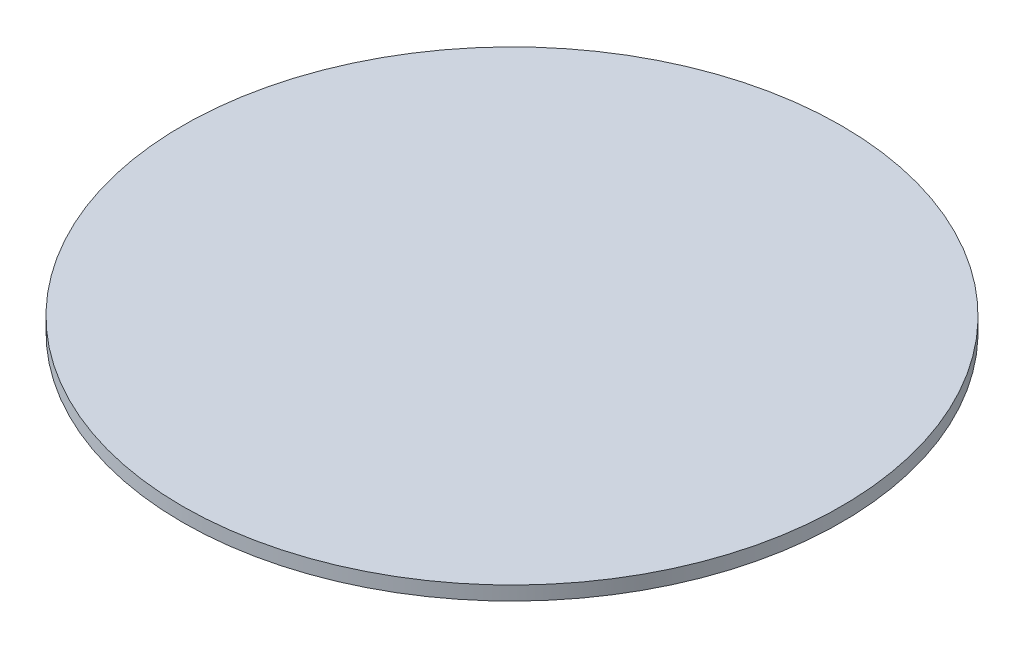
ISO-10303-21;
HEADER;
FILE_DESCRIPTION(('STEP AP214'),'2;1');
FILE_NAME('part.step','',(''),(''),'','','');
FILE_SCHEMA(('AUTOMOTIVE_DESIGN { 1 0 10303 214 1 1 1 1 }'));
ENDSEC;
DATA;
#1=APPLICATION_CONTEXT('core data for automotive mechanical design processes');
#2=APPLICATION_PROTOCOL_DEFINITION('international standard','automotive_design',2000,#1);
#3=PRODUCT_CONTEXT('',#1,'mechanical');
#4=PRODUCT('Part','Part','',(#3));
#5=PRODUCT_RELATED_PRODUCT_CATEGORY('part','',(#4));
#6=PRODUCT_DEFINITION_FORMATION('','',#4);
#7=PRODUCT_DEFINITION_CONTEXT('part definition',#1,'design');
#8=PRODUCT_DEFINITION('design','',#6,#7);
#9=PRODUCT_DEFINITION_SHAPE('','',#8);
#10=(LENGTH_UNIT() NAMED_UNIT(*) SI_UNIT(.MILLI.,.METRE.));
#11=(NAMED_UNIT(*) PLANE_ANGLE_UNIT() SI_UNIT($,.RADIAN.));
#12=(NAMED_UNIT(*) SI_UNIT($,.STERADIAN.) SOLID_ANGLE_UNIT());
#13=UNCERTAINTY_MEASURE_WITH_UNIT(LENGTH_MEASURE(1.E-05),#10,'distance_accuracy_value','');
#14=(GEOMETRIC_REPRESENTATION_CONTEXT(3) GLOBAL_UNCERTAINTY_ASSIGNED_CONTEXT((#13)) GLOBAL_UNIT_ASSIGNED_CONTEXT((#10,
#11,#12)) REPRESENTATION_CONTEXT('',''));
#15=CARTESIAN_POINT('',(0.,0.,0.));
#16=DIRECTION('',(0.,0.,1.));
#17=DIRECTION('',(1.,0.,0.));
#18=AXIS2_PLACEMENT_3D('',#15,#16,#17);
#19=CARTESIAN_POINT('',(0.,3.175,0.));
#20=DIRECTION('',(0.,-1.,0.));
#21=DIRECTION('',(0.,0.,-1.));
#22=AXIS2_PLACEMENT_3D('',#19,#20,#21);
#23=CYLINDRICAL_SURFACE('',#22,75.184);
#24=CARTESIAN_POINT('',(0.,3.175,0.));
#25=DIRECTION('',(0.,1.,0.));
#26=DIRECTION('',(0.,0.,1.));
#27=AXIS2_PLACEMENT_3D('',#24,#25,#26);
#28=CIRCLE('',#27,75.184);
#29=CARTESIAN_POINT('',(0.,3.175,75.184));
#30=VERTEX_POINT('',#29);
#31=EDGE_CURVE('E10',#30,#30,#28,.T.);
#32=ORIENTED_EDGE('',*,*,#31,.F.);
#33=EDGE_LOOP('',(#32));
#34=FACE_BOUND('',#33,.T.);
#35=CARTESIAN_POINT('',(0.,0.,0.));
#36=DIRECTION('',(0.,1.,0.));
#37=DIRECTION('',(0.,0.,1.));
#38=AXIS2_PLACEMENT_3D('',#35,#36,#37);
#39=CIRCLE('',#38,75.184);
#40=CARTESIAN_POINT('',(0.,0.,75.184));
#41=VERTEX_POINT('',#40);
#42=EDGE_CURVE('E40',#41,#41,#39,.T.);
#43=ORIENTED_EDGE('',*,*,#42,.T.);
#44=EDGE_LOOP('',(#43));
#45=FACE_BOUND('',#44,.T.);
#46=ADVANCED_FACE('F37',(#34,#45),#23,.T.);
#47=CARTESIAN_POINT('',(0.,3.175,0.));
#48=DIRECTION('',(0.,1.,0.));
#49=DIRECTION('',(0.,0.,1.));
#50=AXIS2_PLACEMENT_3D('',#47,#48,#49);
#51=PLANE('',#50);
#52=ORIENTED_EDGE('',*,*,#31,.T.);
#53=EDGE_LOOP('',(#52));
#54=FACE_BOUND('',#53,.T.);
#55=ADVANCED_FACE('F52',(#54),#51,.T.);
#56=CARTESIAN_POINT('',(0.,0.,0.));
#57=DIRECTION('',(0.,1.,0.));
#58=DIRECTION('',(0.,0.,1.));
#59=AXIS2_PLACEMENT_3D('',#56,#57,#58);
#60=PLANE('',#59);
#61=ORIENTED_EDGE('',*,*,#42,.F.);
#62=EDGE_LOOP('',(#61));
#63=FACE_BOUND('',#62,.T.);
#64=ADVANCED_FACE('F50',(#63),#60,.F.);
#65=CLOSED_SHELL('',(#46,#55,#64));
#66=MANIFOLD_SOLID_BREP('B2',#65);
#67=ADVANCED_BREP_SHAPE_REPRESENTATION('',(#18,#66),#14);
#68=SHAPE_DEFINITION_REPRESENTATION(#9,#67);
ENDSEC;
END-ISO-10303-21;
